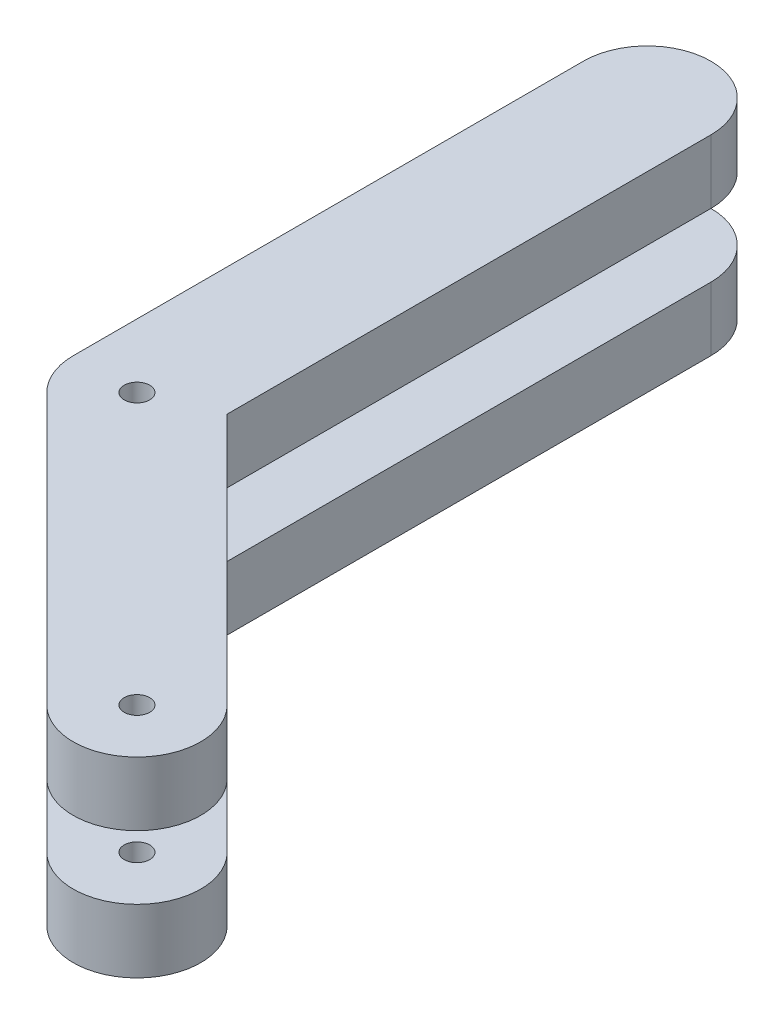
ISO-10303-21;
HEADER;
FILE_DESCRIPTION(('STEP AP214'),'2;1');
FILE_NAME('part.step','',(''),(''),'','','');
FILE_SCHEMA(('AUTOMOTIVE_DESIGN { 1 0 10303 214 1 1 1 1 }'));
ENDSEC;
DATA;
#1=APPLICATION_CONTEXT('core data for automotive mechanical design processes');
#2=APPLICATION_PROTOCOL_DEFINITION('international standard','automotive_design',2000,#1);
#3=PRODUCT_CONTEXT('',#1,'mechanical');
#4=PRODUCT('Part','Part','',(#3));
#5=PRODUCT_RELATED_PRODUCT_CATEGORY('part','',(#4));
#6=PRODUCT_DEFINITION_FORMATION('','',#4);
#7=PRODUCT_DEFINITION_CONTEXT('part definition',#1,'design');
#8=PRODUCT_DEFINITION('design','',#6,#7);
#9=PRODUCT_DEFINITION_SHAPE('','',#8);
#10=(LENGTH_UNIT() NAMED_UNIT(*) SI_UNIT(.MILLI.,.METRE.));
#11=(NAMED_UNIT(*) PLANE_ANGLE_UNIT() SI_UNIT($,.RADIAN.));
#12=(NAMED_UNIT(*) SI_UNIT($,.STERADIAN.) SOLID_ANGLE_UNIT());
#13=UNCERTAINTY_MEASURE_WITH_UNIT(LENGTH_MEASURE(1.E-05),#10,'distance_accuracy_value','');
#14=(GEOMETRIC_REPRESENTATION_CONTEXT(3) GLOBAL_UNCERTAINTY_ASSIGNED_CONTEXT((#13)) GLOBAL_UNIT_ASSIGNED_CONTEXT((#10,
#11,#12)) REPRESENTATION_CONTEXT('',''));
#15=CARTESIAN_POINT('',(0.,0.,0.));
#16=DIRECTION('',(0.,0.,1.));
#17=DIRECTION('',(1.,0.,0.));
#18=AXIS2_PLACEMENT_3D('',#15,#16,#17);
#19=CARTESIAN_POINT('',(0.,15.,-40.));
#20=DIRECTION('',(0.,1.,0.));
#21=DIRECTION('',(0.,0.,1.));
#22=AXIS2_PLACEMENT_3D('',#19,#20,#21);
#23=PLANE('',#22);
#24=CARTESIAN_POINT('',(0.,15.,0.));
#25=DIRECTION('',(0.,1.,0.));
#26=DIRECTION('',(0.,0.,1.));
#27=AXIS2_PLACEMENT_3D('',#24,#25,#26);
#28=CIRCLE('',#27,1.);
#29=CARTESIAN_POINT('',(0.,15.,1.));
#30=VERTEX_POINT('',#29);
#31=EDGE_CURVE('P0_E111',#30,#30,#28,.T.);
#32=ORIENTED_EDGE('',*,*,#31,.F.);
#33=EDGE_LOOP('',(#32));
#34=FACE_BOUND('',#33,.T.);
#35=CARTESIAN_POINT('',(0.,15.,-40.));
#36=DIRECTION('',(0.,1.,0.));
#37=DIRECTION('',(0.,0.,1.));
#38=AXIS2_PLACEMENT_3D('',#35,#36,#37);
#39=CIRCLE('',#38,5.);
#40=CARTESIAN_POINT('',(5.,15.,-40.));
#41=VERTEX_POINT('',#40);
#42=CARTESIAN_POINT('',(-5.,15.,-40.));
#43=VERTEX_POINT('',#42);
#44=EDGE_CURVE('P0_E120',#41,#43,#39,.T.);
#45=ORIENTED_EDGE('',*,*,#44,.T.);
#46=DIRECTION('',(0.,0.,1.));
#47=VECTOR('',#46,1.);
#48=CARTESIAN_POINT('',(-5.,15.,-40.));
#49=LINE('',#48,#47);
#50=CARTESIAN_POINT('',(-5.,15.,0.));
#51=VERTEX_POINT('',#50);
#52=EDGE_CURVE('P0_E73',#43,#51,#49,.T.);
#53=ORIENTED_EDGE('',*,*,#52,.T.);
#54=CARTESIAN_POINT('',(0.,15.,0.));
#55=DIRECTION('',(0.,1.,0.));
#56=DIRECTION('',(0.,0.,1.));
#57=AXIS2_PLACEMENT_3D('',#54,#55,#56);
#58=CIRCLE('',#57,5.);
#59=CARTESIAN_POINT('',(-3.53553390593274,15.,3.53553390593274));
#60=VERTEX_POINT('',#59);
#61=EDGE_CURVE('P0_E132',#51,#60,#58,.T.);
#62=ORIENTED_EDGE('',*,*,#61,.T.);
#63=DIRECTION('',(0.707106781186547,0.,0.707106781186547));
#64=VECTOR('',#63,1.);
#65=CARTESIAN_POINT('',(-3.53553390593274,15.,3.53553390593274));
#66=LINE('',#65,#64);
#67=CARTESIAN_POINT('',(17.6776695296637,15.,24.7487373415292));
#68=VERTEX_POINT('',#67);
#69=EDGE_CURVE('P0_E89',#60,#68,#66,.T.);
#70=ORIENTED_EDGE('',*,*,#69,.T.);
#71=CARTESIAN_POINT('',(21.2132034355964,15.,21.2132034355964));
#72=DIRECTION('',(0.,1.,0.));
#73=DIRECTION('',(0.,0.,1.));
#74=AXIS2_PLACEMENT_3D('',#71,#72,#73);
#75=CIRCLE('',#74,5.);
#76=CARTESIAN_POINT('',(24.7487373415292,15.,17.6776695296637));
#77=VERTEX_POINT('',#76);
#78=EDGE_CURVE('P0_E83',#68,#77,#75,.T.);
#79=ORIENTED_EDGE('',*,*,#78,.T.);
#80=DIRECTION('',(-0.707106781186548,0.,-0.707106781186548));
#81=VECTOR('',#80,1.);
#82=CARTESIAN_POINT('',(5.,15.,-2.07106781186547));
#83=LINE('',#82,#81);
#84=CARTESIAN_POINT('',(5.,15.,-2.07106781186547));
#85=VERTEX_POINT('',#84);
#86=EDGE_CURVE('P0_E87',#77,#85,#83,.T.);
#87=ORIENTED_EDGE('',*,*,#86,.T.);
#88=DIRECTION('',(0.,0.,-1.));
#89=VECTOR('',#88,1.);
#90=CARTESIAN_POINT('',(5.,15.,-40.));
#91=LINE('',#90,#89);
#92=EDGE_CURVE('P0_E33',#85,#41,#91,.T.);
#93=ORIENTED_EDGE('',*,*,#92,.T.);
#94=EDGE_LOOP('',(#45,#53,#62,#70,#79,#87,#93));
#95=FACE_BOUND('',#94,.T.);
#96=CARTESIAN_POINT('',(21.2132034355964,15.,21.2132034355964));
#97=DIRECTION('',(0.,1.,0.));
#98=DIRECTION('',(0.,0.,1.));
#99=AXIS2_PLACEMENT_3D('',#96,#97,#98);
#100=CIRCLE('',#99,1.);
#101=CARTESIAN_POINT('',(21.2132034355964,15.,22.2132034355964));
#102=VERTEX_POINT('',#101);
#103=EDGE_CURVE('P0_E147',#102,#102,#100,.T.);
#104=ORIENTED_EDGE('',*,*,#103,.F.);
#105=EDGE_LOOP('',(#104));
#106=FACE_BOUND('',#105,.T.);
#107=ADVANCED_FACE('P0_F16',(#34,#95,#106),#23,.T.);
#108=CARTESIAN_POINT('',(0.,10.,-40.));
#109=DIRECTION('',(0.,1.,0.));
#110=DIRECTION('',(0.,0.,1.));
#111=AXIS2_PLACEMENT_3D('',#108,#109,#110);
#112=PLANE('',#111);
#113=CARTESIAN_POINT('',(0.,10.,-40.));
#114=DIRECTION('',(0.,1.,0.));
#115=DIRECTION('',(0.,0.,1.));
#116=AXIS2_PLACEMENT_3D('',#113,#114,#115);
#117=CIRCLE('',#116,5.);
#118=CARTESIAN_POINT('',(5.,10.,-40.));
#119=VERTEX_POINT('',#118);
#120=CARTESIAN_POINT('',(-5.,10.,-40.));
#121=VERTEX_POINT('',#120);
#122=EDGE_CURVE('P0_E107',#119,#121,#117,.T.);
#123=ORIENTED_EDGE('',*,*,#122,.F.);
#124=DIRECTION('',(0.,0.,-1.));
#125=VECTOR('',#124,1.);
#126=CARTESIAN_POINT('',(5.,10.,-40.));
#127=LINE('',#126,#125);
#128=CARTESIAN_POINT('',(5.,10.,-2.07106781186547));
#129=VERTEX_POINT('',#128);
#130=EDGE_CURVE('P0_E65',#129,#119,#127,.T.);
#131=ORIENTED_EDGE('',*,*,#130,.F.);
#132=DIRECTION('',(-0.707106781186548,0.,-0.707106781186548));
#133=VECTOR('',#132,1.);
#134=CARTESIAN_POINT('',(5.,10.,-2.07106781186547));
#135=LINE('',#134,#133);
#136=CARTESIAN_POINT('',(24.7487373415292,10.,17.6776695296637));
#137=VERTEX_POINT('',#136);
#138=EDGE_CURVE('P0_E59',#137,#129,#135,.T.);
#139=ORIENTED_EDGE('',*,*,#138,.F.);
#140=CARTESIAN_POINT('',(21.2132034355964,10.,21.2132034355964));
#141=DIRECTION('',(0.,1.,0.));
#142=DIRECTION('',(0.,0.,1.));
#143=AXIS2_PLACEMENT_3D('',#140,#141,#142);
#144=CIRCLE('',#143,5.);
#145=CARTESIAN_POINT('',(17.6776695296637,10.,24.7487373415292));
#146=VERTEX_POINT('',#145);
#147=EDGE_CURVE('P0_E97',#146,#137,#144,.T.);
#148=ORIENTED_EDGE('',*,*,#147,.F.);
#149=DIRECTION('',(0.707106781186547,0.,0.707106781186547));
#150=VECTOR('',#149,1.);
#151=CARTESIAN_POINT('',(-3.53553390593274,10.,3.53553390593274));
#152=LINE('',#151,#150);
#153=CARTESIAN_POINT('',(-3.53553390593274,10.,3.53553390593274));
#154=VERTEX_POINT('',#153);
#155=EDGE_CURVE('P0_E115',#154,#146,#152,.T.);
#156=ORIENTED_EDGE('',*,*,#155,.F.);
#157=CARTESIAN_POINT('',(0.,10.,0.));
#158=DIRECTION('',(0.,1.,0.));
#159=DIRECTION('',(0.,0.,1.));
#160=AXIS2_PLACEMENT_3D('',#157,#158,#159);
#161=CIRCLE('',#160,5.);
#162=CARTESIAN_POINT('',(-5.,10.,0.));
#163=VERTEX_POINT('',#162);
#164=EDGE_CURVE('P0_E113',#163,#154,#161,.T.);
#165=ORIENTED_EDGE('',*,*,#164,.F.);
#166=DIRECTION('',(0.,0.,1.));
#167=VECTOR('',#166,1.);
#168=CARTESIAN_POINT('',(-5.,10.,-40.));
#169=LINE('',#168,#167);
#170=EDGE_CURVE('P0_E110',#121,#163,#169,.T.);
#171=ORIENTED_EDGE('',*,*,#170,.F.);
#172=EDGE_LOOP('',(#123,#131,#139,#148,#156,#165,#171));
#173=FACE_BOUND('',#172,.T.);
#174=CARTESIAN_POINT('',(0.,10.,0.));
#175=DIRECTION('',(0.,1.,0.));
#176=DIRECTION('',(0.,0.,1.));
#177=AXIS2_PLACEMENT_3D('',#174,#175,#176);
#178=CIRCLE('',#177,1.);
#179=CARTESIAN_POINT('',(0.,10.,1.));
#180=VERTEX_POINT('',#179);
#181=EDGE_CURVE('P0_E144',#180,#180,#178,.T.);
#182=ORIENTED_EDGE('',*,*,#181,.T.);
#183=EDGE_LOOP('',(#182));
#184=FACE_BOUND('',#183,.T.);
#185=CARTESIAN_POINT('',(21.2132034355964,10.,21.2132034355964));
#186=DIRECTION('',(0.,1.,0.));
#187=DIRECTION('',(0.,0.,1.));
#188=AXIS2_PLACEMENT_3D('',#185,#186,#187);
#189=CIRCLE('',#188,1.);
#190=CARTESIAN_POINT('',(21.2132034355964,10.,22.2132034355964));
#191=VERTEX_POINT('',#190);
#192=EDGE_CURVE('P0_E150',#191,#191,#189,.T.);
#193=ORIENTED_EDGE('',*,*,#192,.T.);
#194=EDGE_LOOP('',(#193));
#195=FACE_BOUND('',#194,.T.);
#196=ADVANCED_FACE('P0_F136',(#173,#184,#195),#112,.F.);
#197=CARTESIAN_POINT('',(0.,15.,-40.));
#198=DIRECTION('',(0.,-1.,0.));
#199=DIRECTION('',(0.,0.,-1.));
#200=AXIS2_PLACEMENT_3D('',#197,#198,#199);
#201=CYLINDRICAL_SURFACE('',#200,5.);
#202=ORIENTED_EDGE('',*,*,#122,.T.);
#203=DIRECTION('',(0.,-1.,0.));
#204=VECTOR('',#203,1.);
#205=CARTESIAN_POINT('',(-5.,15.,-40.));
#206=LINE('',#205,#204);
#207=EDGE_CURVE('P0_E11',#43,#121,#206,.T.);
#208=ORIENTED_EDGE('',*,*,#207,.F.);
#209=ORIENTED_EDGE('',*,*,#44,.F.);
#210=DIRECTION('',(0.,-1.,0.));
#211=VECTOR('',#210,1.);
#212=CARTESIAN_POINT('',(5.,15.,-40.));
#213=LINE('',#212,#211);
#214=EDGE_CURVE('P0_E103',#41,#119,#213,.T.);
#215=ORIENTED_EDGE('',*,*,#214,.T.);
#216=EDGE_LOOP('',(#202,#208,#209,#215));
#217=FACE_BOUND('',#216,.T.);
#218=ADVANCED_FACE('P0_F18',(#217),#201,.T.);
#219=CARTESIAN_POINT('',(-5.,15.,-40.));
#220=DIRECTION('',(1.,0.,0.));
#221=DIRECTION('',(0.,0.,-1.));
#222=AXIS2_PLACEMENT_3D('',#219,#220,#221);
#223=PLANE('',#222);
#224=ORIENTED_EDGE('',*,*,#170,.T.);
#225=DIRECTION('',(0.,-1.,0.));
#226=VECTOR('',#225,1.);
#227=CARTESIAN_POINT('',(-5.,15.,0.));
#228=LINE('',#227,#226);
#229=EDGE_CURVE('P0_E25',#51,#163,#228,.T.);
#230=ORIENTED_EDGE('',*,*,#229,.F.);
#231=ORIENTED_EDGE('',*,*,#52,.F.);
#232=ORIENTED_EDGE('',*,*,#207,.T.);
#233=EDGE_LOOP('',(#224,#230,#231,#232));
#234=FACE_BOUND('',#233,.T.);
#235=ADVANCED_FACE('P0_F181',(#234),#223,.F.);
#236=CARTESIAN_POINT('',(0.,15.,0.));
#237=DIRECTION('',(0.,-1.,0.));
#238=DIRECTION('',(0.,0.,-1.));
#239=AXIS2_PLACEMENT_3D('',#236,#237,#238);
#240=CYLINDRICAL_SURFACE('',#239,5.);
#241=ORIENTED_EDGE('',*,*,#164,.T.);
#242=DIRECTION('',(0.,-1.,0.));
#243=VECTOR('',#242,1.);
#244=CARTESIAN_POINT('',(-3.53553390593274,15.,3.53553390593274));
#245=LINE('',#244,#243);
#246=EDGE_CURVE('P0_E124',#60,#154,#245,.T.);
#247=ORIENTED_EDGE('',*,*,#246,.F.);
#248=ORIENTED_EDGE('',*,*,#61,.F.);
#249=ORIENTED_EDGE('',*,*,#229,.T.);
#250=EDGE_LOOP('',(#241,#247,#248,#249));
#251=FACE_BOUND('',#250,.T.);
#252=ADVANCED_FACE('P0_F130',(#251),#240,.T.);
#253=CARTESIAN_POINT('',(-3.53553390593274,15.,3.53553390593274));
#254=DIRECTION('',(0.707106781186548,0.,-0.707106781186548));
#255=DIRECTION('',(-0.707106781186548,0.,-0.707106781186548));
#256=AXIS2_PLACEMENT_3D('',#253,#254,#255);
#257=PLANE('',#256);
#258=ORIENTED_EDGE('',*,*,#155,.T.);
#259=DIRECTION('',(0.,-1.,0.));
#260=VECTOR('',#259,1.);
#261=CARTESIAN_POINT('',(17.6776695296637,15.,24.7487373415292));
#262=LINE('',#261,#260);
#263=EDGE_CURVE('P0_E98',#68,#146,#262,.T.);
#264=ORIENTED_EDGE('',*,*,#263,.F.);
#265=ORIENTED_EDGE('',*,*,#69,.F.);
#266=ORIENTED_EDGE('',*,*,#246,.T.);
#267=EDGE_LOOP('',(#258,#264,#265,#266));
#268=FACE_BOUND('',#267,.T.);
#269=ADVANCED_FACE('P0_F139',(#268),#257,.F.);
#270=CARTESIAN_POINT('',(21.2132034355964,15.,21.2132034355964));
#271=DIRECTION('',(0.,-1.,0.));
#272=DIRECTION('',(0.,0.,-1.));
#273=AXIS2_PLACEMENT_3D('',#270,#271,#272);
#274=CYLINDRICAL_SURFACE('',#273,5.);
#275=ORIENTED_EDGE('',*,*,#147,.T.);
#276=DIRECTION('',(0.,-1.,0.));
#277=VECTOR('',#276,1.);
#278=CARTESIAN_POINT('',(24.7487373415292,15.,17.6776695296637));
#279=LINE('',#278,#277);
#280=EDGE_CURVE('P0_E94',#77,#137,#279,.T.);
#281=ORIENTED_EDGE('',*,*,#280,.F.);
#282=ORIENTED_EDGE('',*,*,#78,.F.);
#283=ORIENTED_EDGE('',*,*,#263,.T.);
#284=EDGE_LOOP('',(#275,#281,#282,#283));
#285=FACE_BOUND('',#284,.T.);
#286=ADVANCED_FACE('P0_F95',(#285),#274,.T.);
#287=CARTESIAN_POINT('',(5.,15.,-2.07106781186547));
#288=DIRECTION('',(-0.707106781186548,0.,0.707106781186548));
#289=DIRECTION('',(0.707106781186548,0.,0.707106781186548));
#290=AXIS2_PLACEMENT_3D('',#287,#288,#289);
#291=PLANE('',#290);
#292=ORIENTED_EDGE('',*,*,#138,.T.);
#293=DIRECTION('',(0.,-1.,0.));
#294=VECTOR('',#293,1.);
#295=CARTESIAN_POINT('',(5.,15.,-2.07106781186547));
#296=LINE('',#295,#294);
#297=EDGE_CURVE('P0_E99',#85,#129,#296,.T.);
#298=ORIENTED_EDGE('',*,*,#297,.F.);
#299=ORIENTED_EDGE('',*,*,#86,.F.);
#300=ORIENTED_EDGE('',*,*,#280,.T.);
#301=EDGE_LOOP('',(#292,#298,#299,#300));
#302=FACE_BOUND('',#301,.T.);
#303=ADVANCED_FACE('P0_F101',(#302),#291,.F.);
#304=CARTESIAN_POINT('',(5.,15.,-40.));
#305=DIRECTION('',(-1.,0.,0.));
#306=DIRECTION('',(0.,0.,1.));
#307=AXIS2_PLACEMENT_3D('',#304,#305,#306);
#308=PLANE('',#307);
#309=ORIENTED_EDGE('',*,*,#130,.T.);
#310=ORIENTED_EDGE('',*,*,#214,.F.);
#311=ORIENTED_EDGE('',*,*,#92,.F.);
#312=ORIENTED_EDGE('',*,*,#297,.T.);
#313=EDGE_LOOP('',(#309,#310,#311,#312));
#314=FACE_BOUND('',#313,.T.);
#315=ADVANCED_FACE('P0_F171',(#314),#308,.F.);
#316=CARTESIAN_POINT('',(0.,15.,0.));
#317=DIRECTION('',(0.,-1.,0.));
#318=DIRECTION('',(0.,0.,-1.));
#319=AXIS2_PLACEMENT_3D('',#316,#317,#318);
#320=CYLINDRICAL_SURFACE('',#319,1.);
#321=ORIENTED_EDGE('',*,*,#31,.T.);
#322=EDGE_LOOP('',(#321));
#323=FACE_BOUND('',#322,.T.);
#324=ORIENTED_EDGE('',*,*,#181,.F.);
#325=EDGE_LOOP('',(#324));
#326=FACE_BOUND('',#325,.T.);
#327=ADVANCED_FACE('P0_F168',(#323,#326),#320,.F.);
#328=CARTESIAN_POINT('',(21.2132034355964,15.,21.2132034355964));
#329=DIRECTION('',(0.,-1.,0.));
#330=DIRECTION('',(0.,0.,-1.));
#331=AXIS2_PLACEMENT_3D('',#328,#329,#330);
#332=CYLINDRICAL_SURFACE('',#331,1.);
#333=ORIENTED_EDGE('',*,*,#103,.T.);
#334=EDGE_LOOP('',(#333));
#335=FACE_BOUND('',#334,.T.);
#336=ORIENTED_EDGE('',*,*,#192,.F.);
#337=EDGE_LOOP('',(#336));
#338=FACE_BOUND('',#337,.T.);
#339=ADVANCED_FACE('P0_F156',(#335,#338),#332,.F.);
#340=CLOSED_SHELL('',(#107,#196,#218,#235,#252,#269,#286,#303,#315,#327,#339));
#341=MANIFOLD_SOLID_BREP('P0_B1',#340);
#342=CARTESIAN_POINT('',(0.,5.,-40.));
#343=DIRECTION('',(0.,1.,0.));
#344=DIRECTION('',(0.,0.,1.));
#345=AXIS2_PLACEMENT_3D('',#342,#343,#344);
#346=PLANE('',#345);
#347=CARTESIAN_POINT('',(0.,5.,0.));
#348=DIRECTION('',(0.,1.,0.));
#349=DIRECTION('',(0.,0.,1.));
#350=AXIS2_PLACEMENT_3D('',#347,#348,#349);
#351=CIRCLE('',#350,1.);
#352=CARTESIAN_POINT('',(0.,5.,1.));
#353=VERTEX_POINT('',#352);
#354=EDGE_CURVE('P1_E110',#353,#353,#351,.T.);
#355=ORIENTED_EDGE('',*,*,#354,.F.);
#356=EDGE_LOOP('',(#355));
#357=FACE_BOUND('',#356,.T.);
#358=CARTESIAN_POINT('',(0.,5.,-40.));
#359=DIRECTION('',(0.,1.,0.));
#360=DIRECTION('',(0.,0.,1.));
#361=AXIS2_PLACEMENT_3D('',#358,#359,#360);
#362=CIRCLE('',#361,5.);
#363=CARTESIAN_POINT('',(5.,5.,-40.));
#364=VERTEX_POINT('',#363);
#365=CARTESIAN_POINT('',(-5.,5.,-40.));
#366=VERTEX_POINT('',#365);
#367=EDGE_CURVE('P1_E119',#364,#366,#362,.T.);
#368=ORIENTED_EDGE('',*,*,#367,.T.);
#369=DIRECTION('',(0.,0.,1.));
#370=VECTOR('',#369,1.);
#371=CARTESIAN_POINT('',(-5.,5.,-40.));
#372=LINE('',#371,#370);
#373=CARTESIAN_POINT('',(-5.,5.,0.));
#374=VERTEX_POINT('',#373);
#375=EDGE_CURVE('P1_E72',#366,#374,#372,.T.);
#376=ORIENTED_EDGE('',*,*,#375,.T.);
#377=CARTESIAN_POINT('',(0.,5.,0.));
#378=DIRECTION('',(0.,1.,0.));
#379=DIRECTION('',(0.,0.,1.));
#380=AXIS2_PLACEMENT_3D('',#377,#378,#379);
#381=CIRCLE('',#380,5.);
#382=CARTESIAN_POINT('',(-3.53553390593274,5.,3.53553390593274));
#383=VERTEX_POINT('',#382);
#384=EDGE_CURVE('P1_E131',#374,#383,#381,.T.);
#385=ORIENTED_EDGE('',*,*,#384,.T.);
#386=DIRECTION('',(0.707106781186547,0.,0.707106781186547));
#387=VECTOR('',#386,1.);
#388=CARTESIAN_POINT('',(-3.53553390593274,5.,3.53553390593274));
#389=LINE('',#388,#387);
#390=CARTESIAN_POINT('',(17.6776695296637,5.,24.7487373415292));
#391=VERTEX_POINT('',#390);
#392=EDGE_CURVE('P1_E88',#383,#391,#389,.T.);
#393=ORIENTED_EDGE('',*,*,#392,.T.);
#394=CARTESIAN_POINT('',(21.2132034355964,5.,21.2132034355964));
#395=DIRECTION('',(0.,1.,0.));
#396=DIRECTION('',(0.,0.,1.));
#397=AXIS2_PLACEMENT_3D('',#394,#395,#396);
#398=CIRCLE('',#397,5.);
#399=CARTESIAN_POINT('',(24.7487373415292,5.,17.6776695296637));
#400=VERTEX_POINT('',#399);
#401=EDGE_CURVE('P1_E82',#391,#400,#398,.T.);
#402=ORIENTED_EDGE('',*,*,#401,.T.);
#403=DIRECTION('',(-0.707106781186548,0.,-0.707106781186548));
#404=VECTOR('',#403,1.);
#405=CARTESIAN_POINT('',(5.,5.,-2.07106781186547));
#406=LINE('',#405,#404);
#407=CARTESIAN_POINT('',(5.,5.,-2.07106781186547));
#408=VERTEX_POINT('',#407);
#409=EDGE_CURVE('P1_E86',#400,#408,#406,.T.);
#410=ORIENTED_EDGE('',*,*,#409,.T.);
#411=DIRECTION('',(0.,0.,-1.));
#412=VECTOR('',#411,1.);
#413=CARTESIAN_POINT('',(5.,5.,-40.));
#414=LINE('',#413,#412);
#415=EDGE_CURVE('P1_E32',#408,#364,#414,.T.);
#416=ORIENTED_EDGE('',*,*,#415,.T.);
#417=EDGE_LOOP('',(#368,#376,#385,#393,#402,#410,#416));
#418=FACE_BOUND('',#417,.T.);
#419=CARTESIAN_POINT('',(21.2132034355964,5.,21.2132034355964));
#420=DIRECTION('',(0.,1.,0.));
#421=DIRECTION('',(0.,0.,1.));
#422=AXIS2_PLACEMENT_3D('',#419,#420,#421);
#423=CIRCLE('',#422,1.);
#424=CARTESIAN_POINT('',(21.2132034355964,5.,22.2132034355964));
#425=VERTEX_POINT('',#424);
#426=EDGE_CURVE('P1_E146',#425,#425,#423,.T.);
#427=ORIENTED_EDGE('',*,*,#426,.F.);
#428=EDGE_LOOP('',(#427));
#429=FACE_BOUND('',#428,.T.);
#430=ADVANCED_FACE('P1_F15',(#357,#418,#429),#346,.T.);
#431=CARTESIAN_POINT('',(0.,0.,-40.));
#432=DIRECTION('',(0.,1.,0.));
#433=DIRECTION('',(0.,0.,1.));
#434=AXIS2_PLACEMENT_3D('',#431,#432,#433);
#435=PLANE('',#434);
#436=CARTESIAN_POINT('',(0.,0.,-40.));
#437=DIRECTION('',(0.,1.,0.));
#438=DIRECTION('',(0.,0.,1.));
#439=AXIS2_PLACEMENT_3D('',#436,#437,#438);
#440=CIRCLE('',#439,5.);
#441=CARTESIAN_POINT('',(5.,0.,-40.));
#442=VERTEX_POINT('',#441);
#443=CARTESIAN_POINT('',(-5.,0.,-40.));
#444=VERTEX_POINT('',#443);
#445=EDGE_CURVE('P1_E106',#442,#444,#440,.T.);
#446=ORIENTED_EDGE('',*,*,#445,.F.);
#447=DIRECTION('',(0.,0.,-1.));
#448=VECTOR('',#447,1.);
#449=CARTESIAN_POINT('',(5.,0.,-40.));
#450=LINE('',#449,#448);
#451=CARTESIAN_POINT('',(5.,0.,-2.07106781186547));
#452=VERTEX_POINT('',#451);
#453=EDGE_CURVE('P1_E64',#452,#442,#450,.T.);
#454=ORIENTED_EDGE('',*,*,#453,.F.);
#455=DIRECTION('',(-0.707106781186548,0.,-0.707106781186548));
#456=VECTOR('',#455,1.);
#457=CARTESIAN_POINT('',(5.,0.,-2.07106781186547));
#458=LINE('',#457,#456);
#459=CARTESIAN_POINT('',(24.7487373415292,0.,17.6776695296637));
#460=VERTEX_POINT('',#459);
#461=EDGE_CURVE('P1_E58',#460,#452,#458,.T.);
#462=ORIENTED_EDGE('',*,*,#461,.F.);
#463=CARTESIAN_POINT('',(21.2132034355964,0.,21.2132034355964));
#464=DIRECTION('',(0.,1.,0.));
#465=DIRECTION('',(0.,0.,1.));
#466=AXIS2_PLACEMENT_3D('',#463,#464,#465);
#467=CIRCLE('',#466,5.);
#468=CARTESIAN_POINT('',(17.6776695296637,0.,24.7487373415292));
#469=VERTEX_POINT('',#468);
#470=EDGE_CURVE('P1_E96',#469,#460,#467,.T.);
#471=ORIENTED_EDGE('',*,*,#470,.F.);
#472=DIRECTION('',(0.707106781186547,0.,0.707106781186547));
#473=VECTOR('',#472,1.);
#474=CARTESIAN_POINT('',(-3.53553390593274,0.,3.53553390593274));
#475=LINE('',#474,#473);
#476=CARTESIAN_POINT('',(-3.53553390593274,0.,3.53553390593274));
#477=VERTEX_POINT('',#476);
#478=EDGE_CURVE('P1_E114',#477,#469,#475,.T.);
#479=ORIENTED_EDGE('',*,*,#478,.F.);
#480=CARTESIAN_POINT('',(0.,0.,0.));
#481=DIRECTION('',(0.,1.,0.));
#482=DIRECTION('',(0.,0.,1.));
#483=AXIS2_PLACEMENT_3D('',#480,#481,#482);
#484=CIRCLE('',#483,5.);
#485=CARTESIAN_POINT('',(-5.,0.,0.));
#486=VERTEX_POINT('',#485);
#487=EDGE_CURVE('P1_E112',#486,#477,#484,.T.);
#488=ORIENTED_EDGE('',*,*,#487,.F.);
#489=DIRECTION('',(0.,0.,1.));
#490=VECTOR('',#489,1.);
#491=CARTESIAN_POINT('',(-5.,0.,-40.));
#492=LINE('',#491,#490);
#493=EDGE_CURVE('P1_E109',#444,#486,#492,.T.);
#494=ORIENTED_EDGE('',*,*,#493,.F.);
#495=EDGE_LOOP('',(#446,#454,#462,#471,#479,#488,#494));
#496=FACE_BOUND('',#495,.T.);
#497=CARTESIAN_POINT('',(0.,0.,0.));
#498=DIRECTION('',(0.,1.,0.));
#499=DIRECTION('',(0.,0.,1.));
#500=AXIS2_PLACEMENT_3D('',#497,#498,#499);
#501=CIRCLE('',#500,1.);
#502=CARTESIAN_POINT('',(0.,0.,1.));
#503=VERTEX_POINT('',#502);
#504=EDGE_CURVE('P1_E143',#503,#503,#501,.T.);
#505=ORIENTED_EDGE('',*,*,#504,.T.);
#506=EDGE_LOOP('',(#505));
#507=FACE_BOUND('',#506,.T.);
#508=CARTESIAN_POINT('',(21.2132034355964,0.,21.2132034355964));
#509=DIRECTION('',(0.,1.,0.));
#510=DIRECTION('',(0.,0.,1.));
#511=AXIS2_PLACEMENT_3D('',#508,#509,#510);
#512=CIRCLE('',#511,1.);
#513=CARTESIAN_POINT('',(21.2132034355964,0.,22.2132034355964));
#514=VERTEX_POINT('',#513);
#515=EDGE_CURVE('P1_E149',#514,#514,#512,.T.);
#516=ORIENTED_EDGE('',*,*,#515,.T.);
#517=EDGE_LOOP('',(#516));
#518=FACE_BOUND('',#517,.T.);
#519=ADVANCED_FACE('P1_F135',(#496,#507,#518),#435,.F.);
#520=CARTESIAN_POINT('',(0.,5.,-40.));
#521=DIRECTION('',(0.,-1.,0.));
#522=DIRECTION('',(0.,0.,-1.));
#523=AXIS2_PLACEMENT_3D('',#520,#521,#522);
#524=CYLINDRICAL_SURFACE('',#523,5.);
#525=ORIENTED_EDGE('',*,*,#445,.T.);
#526=DIRECTION('',(0.,-1.,0.));
#527=VECTOR('',#526,1.);
#528=CARTESIAN_POINT('',(-5.,5.,-40.));
#529=LINE('',#528,#527);
#530=EDGE_CURVE('P1_E10',#366,#444,#529,.T.);
#531=ORIENTED_EDGE('',*,*,#530,.F.);
#532=ORIENTED_EDGE('',*,*,#367,.F.);
#533=DIRECTION('',(0.,-1.,0.));
#534=VECTOR('',#533,1.);
#535=CARTESIAN_POINT('',(5.,5.,-40.));
#536=LINE('',#535,#534);
#537=EDGE_CURVE('P1_E102',#364,#442,#536,.T.);
#538=ORIENTED_EDGE('',*,*,#537,.T.);
#539=EDGE_LOOP('',(#525,#531,#532,#538));
#540=FACE_BOUND('',#539,.T.);
#541=ADVANCED_FACE('P1_F17',(#540),#524,.T.);
#542=CARTESIAN_POINT('',(-5.,5.,-40.));
#543=DIRECTION('',(1.,0.,0.));
#544=DIRECTION('',(0.,0.,-1.));
#545=AXIS2_PLACEMENT_3D('',#542,#543,#544);
#546=PLANE('',#545);
#547=ORIENTED_EDGE('',*,*,#493,.T.);
#548=DIRECTION('',(0.,-1.,0.));
#549=VECTOR('',#548,1.);
#550=CARTESIAN_POINT('',(-5.,5.,0.));
#551=LINE('',#550,#549);
#552=EDGE_CURVE('P1_E24',#374,#486,#551,.T.);
#553=ORIENTED_EDGE('',*,*,#552,.F.);
#554=ORIENTED_EDGE('',*,*,#375,.F.);
#555=ORIENTED_EDGE('',*,*,#530,.T.);
#556=EDGE_LOOP('',(#547,#553,#554,#555));
#557=FACE_BOUND('',#556,.T.);
#558=ADVANCED_FACE('P1_F180',(#557),#546,.F.);
#559=CARTESIAN_POINT('',(0.,5.,0.));
#560=DIRECTION('',(0.,-1.,0.));
#561=DIRECTION('',(0.,0.,-1.));
#562=AXIS2_PLACEMENT_3D('',#559,#560,#561);
#563=CYLINDRICAL_SURFACE('',#562,5.);
#564=ORIENTED_EDGE('',*,*,#487,.T.);
#565=DIRECTION('',(0.,-1.,0.));
#566=VECTOR('',#565,1.);
#567=CARTESIAN_POINT('',(-3.53553390593274,5.,3.53553390593274));
#568=LINE('',#567,#566);
#569=EDGE_CURVE('P1_E123',#383,#477,#568,.T.);
#570=ORIENTED_EDGE('',*,*,#569,.F.);
#571=ORIENTED_EDGE('',*,*,#384,.F.);
#572=ORIENTED_EDGE('',*,*,#552,.T.);
#573=EDGE_LOOP('',(#564,#570,#571,#572));
#574=FACE_BOUND('',#573,.T.);
#575=ADVANCED_FACE('P1_F129',(#574),#563,.T.);
#576=CARTESIAN_POINT('',(-3.53553390593274,5.,3.53553390593274));
#577=DIRECTION('',(0.707106781186548,0.,-0.707106781186548));
#578=DIRECTION('',(-0.707106781186548,0.,-0.707106781186548));
#579=AXIS2_PLACEMENT_3D('',#576,#577,#578);
#580=PLANE('',#579);
#581=ORIENTED_EDGE('',*,*,#478,.T.);
#582=DIRECTION('',(0.,-1.,0.));
#583=VECTOR('',#582,1.);
#584=CARTESIAN_POINT('',(17.6776695296637,5.,24.7487373415292));
#585=LINE('',#584,#583);
#586=EDGE_CURVE('P1_E97',#391,#469,#585,.T.);
#587=ORIENTED_EDGE('',*,*,#586,.F.);
#588=ORIENTED_EDGE('',*,*,#392,.F.);
#589=ORIENTED_EDGE('',*,*,#569,.T.);
#590=EDGE_LOOP('',(#581,#587,#588,#589));
#591=FACE_BOUND('',#590,.T.);
#592=ADVANCED_FACE('P1_F138',(#591),#580,.F.);
#593=CARTESIAN_POINT('',(21.2132034355964,5.,21.2132034355964));
#594=DIRECTION('',(0.,-1.,0.));
#595=DIRECTION('',(0.,0.,-1.));
#596=AXIS2_PLACEMENT_3D('',#593,#594,#595);
#597=CYLINDRICAL_SURFACE('',#596,5.);
#598=ORIENTED_EDGE('',*,*,#470,.T.);
#599=DIRECTION('',(0.,-1.,0.));
#600=VECTOR('',#599,1.);
#601=CARTESIAN_POINT('',(24.7487373415292,5.,17.6776695296637));
#602=LINE('',#601,#600);
#603=EDGE_CURVE('P1_E93',#400,#460,#602,.T.);
#604=ORIENTED_EDGE('',*,*,#603,.F.);
#605=ORIENTED_EDGE('',*,*,#401,.F.);
#606=ORIENTED_EDGE('',*,*,#586,.T.);
#607=EDGE_LOOP('',(#598,#604,#605,#606));
#608=FACE_BOUND('',#607,.T.);
#609=ADVANCED_FACE('P1_F94',(#608),#597,.T.);
#610=CARTESIAN_POINT('',(5.,5.,-2.07106781186547));
#611=DIRECTION('',(-0.707106781186548,0.,0.707106781186548));
#612=DIRECTION('',(0.707106781186548,0.,0.707106781186548));
#613=AXIS2_PLACEMENT_3D('',#610,#611,#612);
#614=PLANE('',#613);
#615=ORIENTED_EDGE('',*,*,#461,.T.);
#616=DIRECTION('',(0.,-1.,0.));
#617=VECTOR('',#616,1.);
#618=CARTESIAN_POINT('',(5.,5.,-2.07106781186547));
#619=LINE('',#618,#617);
#620=EDGE_CURVE('P1_E98',#408,#452,#619,.T.);
#621=ORIENTED_EDGE('',*,*,#620,.F.);
#622=ORIENTED_EDGE('',*,*,#409,.F.);
#623=ORIENTED_EDGE('',*,*,#603,.T.);
#624=EDGE_LOOP('',(#615,#621,#622,#623));
#625=FACE_BOUND('',#624,.T.);
#626=ADVANCED_FACE('P1_F100',(#625),#614,.F.);
#627=CARTESIAN_POINT('',(5.,5.,-40.));
#628=DIRECTION('',(-1.,0.,0.));
#629=DIRECTION('',(0.,0.,1.));
#630=AXIS2_PLACEMENT_3D('',#627,#628,#629);
#631=PLANE('',#630);
#632=ORIENTED_EDGE('',*,*,#453,.T.);
#633=ORIENTED_EDGE('',*,*,#537,.F.);
#634=ORIENTED_EDGE('',*,*,#415,.F.);
#635=ORIENTED_EDGE('',*,*,#620,.T.);
#636=EDGE_LOOP('',(#632,#633,#634,#635));
#637=FACE_BOUND('',#636,.T.);
#638=ADVANCED_FACE('P1_F170',(#637),#631,.F.);
#639=CARTESIAN_POINT('',(0.,5.,0.));
#640=DIRECTION('',(0.,-1.,0.));
#641=DIRECTION('',(0.,0.,-1.));
#642=AXIS2_PLACEMENT_3D('',#639,#640,#641);
#643=CYLINDRICAL_SURFACE('',#642,1.);
#644=ORIENTED_EDGE('',*,*,#354,.T.);
#645=EDGE_LOOP('',(#644));
#646=FACE_BOUND('',#645,.T.);
#647=ORIENTED_EDGE('',*,*,#504,.F.);
#648=EDGE_LOOP('',(#647));
#649=FACE_BOUND('',#648,.T.);
#650=ADVANCED_FACE('P1_F167',(#646,#649),#643,.F.);
#651=CARTESIAN_POINT('',(21.2132034355964,5.,21.2132034355964));
#652=DIRECTION('',(0.,-1.,0.));
#653=DIRECTION('',(0.,0.,-1.));
#654=AXIS2_PLACEMENT_3D('',#651,#652,#653);
#655=CYLINDRICAL_SURFACE('',#654,1.);
#656=ORIENTED_EDGE('',*,*,#426,.T.);
#657=EDGE_LOOP('',(#656));
#658=FACE_BOUND('',#657,.T.);
#659=ORIENTED_EDGE('',*,*,#515,.F.);
#660=EDGE_LOOP('',(#659));
#661=FACE_BOUND('',#660,.T.);
#662=ADVANCED_FACE('P1_F155',(#658,#661),#655,.F.);
#663=CLOSED_SHELL('',(#430,#519,#541,#558,#575,#592,#609,#626,#638,#650,#662));
#664=MANIFOLD_SOLID_BREP('P1_B1',#663);
#665=ADVANCED_BREP_SHAPE_REPRESENTATION('',(#18,#341,#664),#14);
#666=SHAPE_DEFINITION_REPRESENTATION(#9,#665);
ENDSEC;
END-ISO-10303-21;
